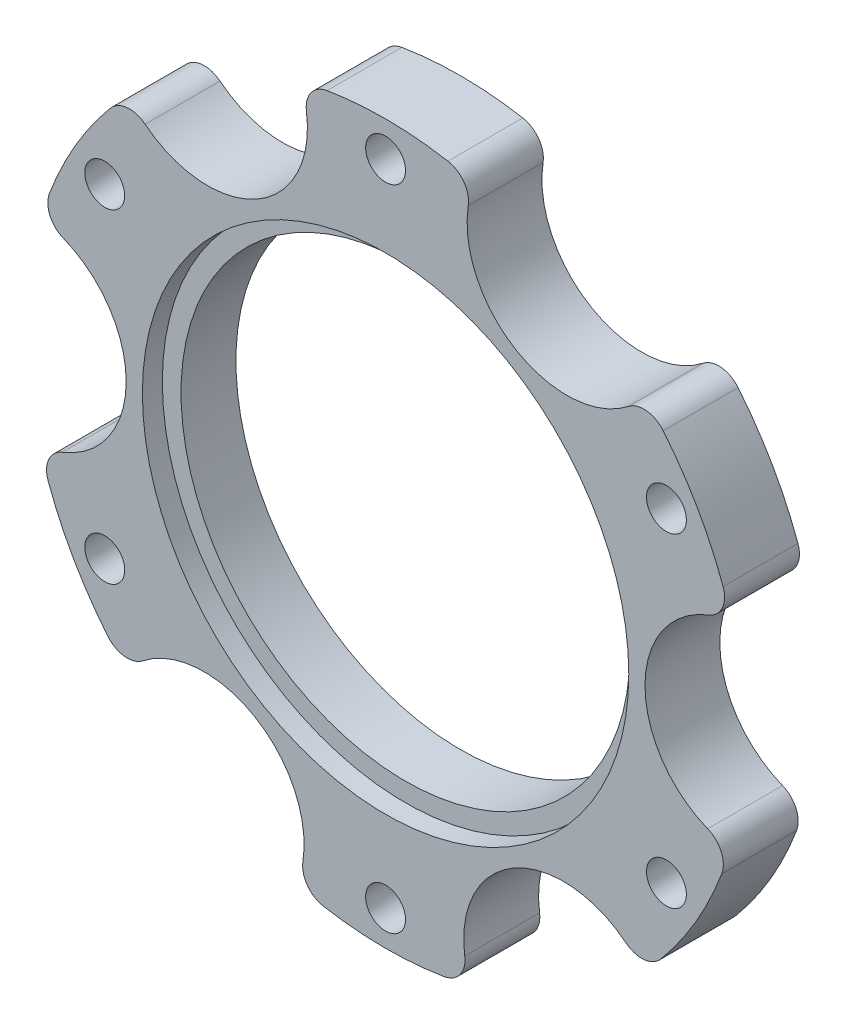
ISO-10303-21;
HEADER;
FILE_DESCRIPTION(('STEP AP214'),'2;1');
FILE_NAME('part.step','',(''),(''),'','','');
FILE_SCHEMA(('AUTOMOTIVE_DESIGN { 1 0 10303 214 1 1 1 1 }'));
ENDSEC;
DATA;
#1=APPLICATION_CONTEXT('core data for automotive mechanical design processes');
#2=APPLICATION_PROTOCOL_DEFINITION('international standard','automotive_design',2000,#1);
#3=PRODUCT_CONTEXT('',#1,'mechanical');
#4=PRODUCT('Part','Part','',(#3));
#5=PRODUCT_RELATED_PRODUCT_CATEGORY('part','',(#4));
#6=PRODUCT_DEFINITION_FORMATION('','',#4);
#7=PRODUCT_DEFINITION_CONTEXT('part definition',#1,'design');
#8=PRODUCT_DEFINITION('design','',#6,#7);
#9=PRODUCT_DEFINITION_SHAPE('','',#8);
#10=(LENGTH_UNIT() NAMED_UNIT(*) SI_UNIT(.MILLI.,.METRE.));
#11=(NAMED_UNIT(*) PLANE_ANGLE_UNIT() SI_UNIT($,.RADIAN.));
#12=(NAMED_UNIT(*) SI_UNIT($,.STERADIAN.) SOLID_ANGLE_UNIT());
#13=UNCERTAINTY_MEASURE_WITH_UNIT(LENGTH_MEASURE(1.E-05),#10,'distance_accuracy_value','');
#14=(GEOMETRIC_REPRESENTATION_CONTEXT(3) GLOBAL_UNCERTAINTY_ASSIGNED_CONTEXT((#13)) GLOBAL_UNIT_ASSIGNED_CONTEXT((#10,
#11,#12)) REPRESENTATION_CONTEXT('',''));
#15=CARTESIAN_POINT('',(0.,0.,0.));
#16=DIRECTION('',(0.,0.,1.));
#17=DIRECTION('',(1.,0.,0.));
#18=AXIS2_PLACEMENT_3D('',#15,#16,#17);
#19=CARTESIAN_POINT('',(0.,0.,3.));
#20=DIRECTION('',(0.,0.,-1.));
#21=DIRECTION('',(-1.,0.,0.));
#22=AXIS2_PLACEMENT_3D('',#19,#20,#21);
#23=CYLINDRICAL_SURFACE('',#22,14.4);
#24=CARTESIAN_POINT('',(0.,0.,0.));
#25=DIRECTION('',(0.,0.,1.));
#26=DIRECTION('',(1.,0.,0.));
#27=AXIS2_PLACEMENT_3D('',#24,#25,#26);
#28=CIRCLE('',#27,14.4);
#29=CARTESIAN_POINT('',(2.49940466150857,14.1814306872766,0.));
#30=VERTEX_POINT('',#29);
#31=CARTESIAN_POINT('',(-2.34663958909103,14.2075079672302,0.));
#32=VERTEX_POINT('',#31);
#33=EDGE_CURVE('E216',#30,#32,#28,.T.);
#34=ORIENTED_EDGE('',*,*,#33,.T.);
#35=DIRECTION('',(0.,0.,-1.));
#36=VECTOR('',#35,1.);
#37=CARTESIAN_POINT('',(-2.34663958909103,14.2075079672302,3.));
#38=LINE('',#37,#36);
#39=CARTESIAN_POINT('',(-2.34663958909103,14.2075079672302,3.));
#40=VERTEX_POINT('',#39);
#41=EDGE_CURVE('E220',#32,#40,#38,.F.);
#42=ORIENTED_EDGE('',*,*,#41,.T.);
#43=CARTESIAN_POINT('',(0.,0.,3.));
#44=DIRECTION('',(0.,0.,1.));
#45=DIRECTION('',(1.,0.,0.));
#46=AXIS2_PLACEMENT_3D('',#43,#44,#45);
#47=CIRCLE('',#46,14.4);
#48=CARTESIAN_POINT('',(2.49940466150857,14.1814306872766,3.));
#49=VERTEX_POINT('',#48);
#50=EDGE_CURVE('E219',#49,#40,#47,.T.);
#51=ORIENTED_EDGE('',*,*,#50,.F.);
#52=DIRECTION('',(0.,0.,-1.));
#53=VECTOR('',#52,1.);
#54=CARTESIAN_POINT('',(2.49940466150857,14.1814306872766,3.));
#55=LINE('',#54,#53);
#56=EDGE_CURVE('E205',#49,#30,#55,.T.);
#57=ORIENTED_EDGE('',*,*,#56,.T.);
#58=EDGE_LOOP('',(#34,#42,#51,#57));
#59=FACE_BOUND('',#58,.T.);
#60=ADVANCED_FACE('F41',(#59),#23,.T.);
#61=CARTESIAN_POINT('',(-11.0317769064353,9.25526327484207,3.));
#62=VERTEX_POINT('',#61);
#63=CARTESIAN_POINT('',(-13.4773826186367,5.07150448593597,3.));
#64=VERTEX_POINT('',#63);
#65=EDGE_CURVE('E269',#62,#64,#47,.T.);
#66=ORIENTED_EDGE('',*,*,#65,.F.);
#67=DIRECTION('',(0.,0.,-1.));
#68=VECTOR('',#67,1.);
#69=CARTESIAN_POINT('',(-11.0317769064353,9.25526327484208,3.));
#70=LINE('',#69,#68);
#71=CARTESIAN_POINT('',(-11.0317769064353,9.25526327484207,0.));
#72=VERTEX_POINT('',#71);
#73=EDGE_CURVE('E292',#62,#72,#70,.T.);
#74=ORIENTED_EDGE('',*,*,#73,.T.);
#75=CARTESIAN_POINT('',(-13.4773826186367,5.07150448593597,0.));
#76=VERTEX_POINT('',#75);
#77=EDGE_CURVE('E229',#72,#76,#28,.T.);
#78=ORIENTED_EDGE('',*,*,#77,.T.);
#79=DIRECTION('',(0.,0.,-1.));
#80=VECTOR('',#79,1.);
#81=CARTESIAN_POINT('',(-13.4773826186367,5.07150448593597,3.));
#82=LINE('',#81,#80);
#83=EDGE_CURVE('E295',#76,#64,#82,.F.);
#84=ORIENTED_EDGE('',*,*,#83,.T.);
#85=EDGE_LOOP('',(#66,#74,#78,#84));
#86=FACE_BOUND('',#85,.T.);
#87=ADVANCED_FACE('F291',(#86),#23,.T.);
#88=CARTESIAN_POINT('',(-13.531181567944,-4.92616741243449,3.));
#89=VERTEX_POINT('',#88);
#90=CARTESIAN_POINT('',(-11.1307430295456,-9.13600348129428,3.));
#91=VERTEX_POINT('',#90);
#92=EDGE_CURVE('E274',#89,#91,#47,.T.);
#93=ORIENTED_EDGE('',*,*,#92,.F.);
#94=DIRECTION('',(0.,0.,-1.));
#95=VECTOR('',#94,1.);
#96=CARTESIAN_POINT('',(-13.531181567944,-4.92616741243449,3.));
#97=LINE('',#96,#95);
#98=CARTESIAN_POINT('',(-13.531181567944,-4.92616741243449,0.));
#99=VERTEX_POINT('',#98);
#100=EDGE_CURVE('E309',#89,#99,#97,.T.);
#101=ORIENTED_EDGE('',*,*,#100,.T.);
#102=CARTESIAN_POINT('',(-11.1307430295456,-9.13600348129428,0.));
#103=VERTEX_POINT('',#102);
#104=EDGE_CURVE('E231',#99,#103,#28,.T.);
#105=ORIENTED_EDGE('',*,*,#104,.T.);
#106=DIRECTION('',(0.,0.,-1.));
#107=VECTOR('',#106,1.);
#108=CARTESIAN_POINT('',(-11.1307430295456,-9.13600348129428,3.));
#109=LINE('',#108,#107);
#110=EDGE_CURVE('E307',#103,#91,#109,.F.);
#111=ORIENTED_EDGE('',*,*,#110,.T.);
#112=EDGE_LOOP('',(#93,#101,#105,#111));
#113=FACE_BOUND('',#112,.T.);
#114=ADVANCED_FACE('F470',(#113),#23,.T.);
#115=CARTESIAN_POINT('',(-2.49940466150866,-14.1814306872765,3.));
#116=VERTEX_POINT('',#115);
#117=CARTESIAN_POINT('',(2.34663958909114,-14.2075079672302,3.));
#118=VERTEX_POINT('',#117);
#119=EDGE_CURVE('E271',#116,#118,#47,.T.);
#120=ORIENTED_EDGE('',*,*,#119,.F.);
#121=DIRECTION('',(0.,0.,-1.));
#122=VECTOR('',#121,1.);
#123=CARTESIAN_POINT('',(-2.49940466150866,-14.1814306872765,3.));
#124=LINE('',#123,#122);
#125=CARTESIAN_POINT('',(-2.49940466150866,-14.1814306872765,0.));
#126=VERTEX_POINT('',#125);
#127=EDGE_CURVE('E317',#116,#126,#124,.T.);
#128=ORIENTED_EDGE('',*,*,#127,.T.);
#129=CARTESIAN_POINT('',(2.34663958909114,-14.2075079672302,0.));
#130=VERTEX_POINT('',#129);
#131=EDGE_CURVE('E239',#126,#130,#28,.T.);
#132=ORIENTED_EDGE('',*,*,#131,.T.);
#133=DIRECTION('',(0.,0.,-1.));
#134=VECTOR('',#133,1.);
#135=CARTESIAN_POINT('',(2.34663958909114,-14.2075079672302,3.));
#136=LINE('',#135,#134);
#137=EDGE_CURVE('E315',#130,#118,#136,.F.);
#138=ORIENTED_EDGE('',*,*,#137,.T.);
#139=EDGE_LOOP('',(#120,#128,#132,#138));
#140=FACE_BOUND('',#139,.T.);
#141=ADVANCED_FACE('F485',(#140),#23,.T.);
#142=CARTESIAN_POINT('',(11.0317769064354,-9.25526327484199,3.));
#143=VERTEX_POINT('',#142);
#144=CARTESIAN_POINT('',(13.4773826186368,-5.07150448593588,3.));
#145=VERTEX_POINT('',#144);
#146=EDGE_CURVE('E233',#143,#145,#47,.T.);
#147=ORIENTED_EDGE('',*,*,#146,.F.);
#148=DIRECTION('',(0.,0.,-1.));
#149=VECTOR('',#148,1.);
#150=CARTESIAN_POINT('',(11.0317769064354,-9.25526327484199,3.));
#151=LINE('',#150,#149);
#152=CARTESIAN_POINT('',(11.0317769064354,-9.25526327484199,0.));
#153=VERTEX_POINT('',#152);
#154=EDGE_CURVE('E325',#143,#153,#151,.T.);
#155=ORIENTED_EDGE('',*,*,#154,.T.);
#156=CARTESIAN_POINT('',(13.4773826186368,-5.07150448593588,0.));
#157=VERTEX_POINT('',#156);
#158=EDGE_CURVE('E234',#153,#157,#28,.T.);
#159=ORIENTED_EDGE('',*,*,#158,.T.);
#160=DIRECTION('',(0.,0.,-1.));
#161=VECTOR('',#160,1.);
#162=CARTESIAN_POINT('',(13.4773826186368,-5.07150448593588,3.));
#163=LINE('',#162,#161);
#164=EDGE_CURVE('E323',#157,#145,#163,.F.);
#165=ORIENTED_EDGE('',*,*,#164,.T.);
#166=EDGE_LOOP('',(#147,#155,#159,#165));
#167=FACE_BOUND('',#166,.T.);
#168=ADVANCED_FACE('F475',(#167),#23,.T.);
#169=CARTESIAN_POINT('',(0.,0.,3.));
#170=DIRECTION('',(0.,0.,-1.));
#171=DIRECTION('',(-1.,0.,0.));
#172=AXIS2_PLACEMENT_3D('',#169,#170,#171);
#173=CYLINDRICAL_SURFACE('',#172,9.);
#174=CARTESIAN_POINT('',(0.,0.,0.));
#175=DIRECTION('',(0.,0.,1.));
#176=DIRECTION('',(1.,0.,0.));
#177=AXIS2_PLACEMENT_3D('',#174,#175,#176);
#178=CIRCLE('',#177,9.);
#179=CARTESIAN_POINT('',(9.,0.,0.));
#180=VERTEX_POINT('',#179);
#181=EDGE_CURVE('E251',#180,#180,#178,.T.);
#182=ORIENTED_EDGE('',*,*,#181,.F.);
#183=EDGE_LOOP('',(#182));
#184=FACE_BOUND('',#183,.T.);
#185=CARTESIAN_POINT('',(0.,0.,2.2));
#186=DIRECTION('',(0.,0.,1.));
#187=DIRECTION('',(1.,0.,0.));
#188=AXIS2_PLACEMENT_3D('',#185,#186,#187);
#189=CIRCLE('',#188,9.);
#190=CARTESIAN_POINT('',(9.,0.,2.2));
#191=VERTEX_POINT('',#190);
#192=EDGE_CURVE('E258',#191,#191,#189,.T.);
#193=ORIENTED_EDGE('',*,*,#192,.T.);
#194=EDGE_LOOP('',(#193));
#195=FACE_BOUND('',#194,.T.);
#196=ADVANCED_FACE('F484',(#184,#195),#173,.F.);
#197=CARTESIAN_POINT('',(0.,0.,3.));
#198=DIRECTION('',(0.,0.,1.));
#199=DIRECTION('',(1.,0.,0.));
#200=AXIS2_PLACEMENT_3D('',#197,#198,#199);
#201=PLANE('',#200);
#202=ORIENTED_EDGE('',*,*,#50,.T.);
#203=CARTESIAN_POINT('',(-2.18367850651527,13.2208754695059,3.));
#204=DIRECTION('',(0.,0.,1.));
#205=DIRECTION('',(1.,0.,0.));
#206=AXIS2_PLACEMENT_3D('',#203,#204,#205);
#207=CIRCLE('',#206,1.);
#208=CARTESIAN_POINT('',(-3.17350074452298,13.078566168526,3.));
#209=VERTEX_POINT('',#208);
#210=EDGE_CURVE('E367',#40,#209,#207,.T.);
#211=ORIENTED_EDGE('',*,*,#210,.T.);
#212=CARTESIAN_POINT('',(-7.13278969655384,12.5093289646062,3.));
#213=DIRECTION('',(0.,0.,1.));
#214=DIRECTION('',(1.,0.,0.));
#215=AXIS2_PLACEMENT_3D('',#212,#213,#214);
#216=CIRCLE('',#215,4.);
#217=CARTESIAN_POINT('',(-9.63910296965706,9.39189511974812,3.));
#218=VERTEX_POINT('',#217);
#219=EDGE_CURVE('E514',#218,#209,#216,.T.);
#220=ORIENTED_EDGE('',*,*,#219,.F.);
#221=CARTESIAN_POINT('',(-10.2656812879329,8.6125366585336,3.));
#222=DIRECTION('',(0.,0.,1.));
#223=DIRECTION('',(1.,0.,0.));
#224=AXIS2_PLACEMENT_3D('',#221,#222,#223);
#225=CIRCLE('',#224,1.);
#226=EDGE_CURVE('E286',#218,#62,#225,.T.);
#227=ORIENTED_EDGE('',*,*,#226,.T.);
#228=ORIENTED_EDGE('',*,*,#65,.T.);
#229=CARTESIAN_POINT('',(-12.5414532701203,4.71931667441264,3.));
#230=DIRECTION('',(0.,0.,1.));
#231=DIRECTION('',(1.,0.,0.));
#232=AXIS2_PLACEMENT_3D('',#229,#230,#231);
#233=CIRCLE('',#232,1.);
#234=CARTESIAN_POINT('',(-12.9131209192807,3.79095082057722,3.));
#235=VERTEX_POINT('',#234);
#236=EDGE_CURVE('E283',#64,#235,#233,.T.);
#237=ORIENTED_EDGE('',*,*,#236,.T.);
#238=CARTESIAN_POINT('',(-14.3997915159224,0.0774874052355363,3.));
#239=DIRECTION('',(0.,0.,1.));
#240=DIRECTION('',(1.,0.,0.));
#241=AXIS2_PLACEMENT_3D('',#238,#239,#240);
#242=CIRCLE('',#241,4.);
#243=CARTESIAN_POINT('',(-12.9531712482095,-3.65176048154302,3.));
#244=VERTEX_POINT('',#243);
#245=EDGE_CURVE('E516',#244,#235,#242,.T.);
#246=ORIENTED_EDGE('',*,*,#245,.F.);
#247=CARTESIAN_POINT('',(-12.5915161812813,-4.58407245323765,3.));
#248=DIRECTION('',(0.,0.,1.));
#249=DIRECTION('',(1.,0.,0.));
#250=AXIS2_PLACEMENT_3D('',#247,#248,#249);
#251=CIRCLE('',#250,1.);
#252=EDGE_CURVE('E363',#244,#89,#251,.T.);
#253=ORIENTED_EDGE('',*,*,#252,.T.);
#254=ORIENTED_EDGE('',*,*,#92,.T.);
#255=CARTESIAN_POINT('',(-10.357774763605,-8.50155879509329,3.));
#256=DIRECTION('',(0.,0.,1.));
#257=DIRECTION('',(1.,0.,0.));
#258=AXIS2_PLACEMENT_3D('',#255,#256,#257);
#259=CIRCLE('',#258,1.);
#260=CARTESIAN_POINT('',(-9.73962017475767,-9.28761534794876,3.));
#261=VERTEX_POINT('',#260);
#262=EDGE_CURVE('E361',#91,#261,#259,.T.);
#263=ORIENTED_EDGE('',*,*,#262,.T.);
#264=CARTESIAN_POINT('',(-7.26700181936847,-12.4318415593707,3.));
#265=DIRECTION('',(0.,0.,1.));
#266=DIRECTION('',(1.,0.,0.));
#267=AXIS2_PLACEMENT_3D('',#264,#265,#266);
#268=CIRCLE('',#267,4.);
#269=CARTESIAN_POINT('',(-3.31406827855237,-13.0436556012911,3.));
#270=VERTEX_POINT('',#269);
#271=EDGE_CURVE('E518',#270,#261,#268,.T.);
#272=ORIENTED_EDGE('',*,*,#271,.F.);
#273=CARTESIAN_POINT('',(-2.32583489334834,-13.1966091117712,3.));
#274=DIRECTION('',(0.,0.,1.));
#275=DIRECTION('',(1.,0.,0.));
#276=AXIS2_PLACEMENT_3D('',#273,#274,#275);
#277=CIRCLE('',#276,1.);
#278=EDGE_CURVE('E359',#270,#116,#277,.T.);
#279=ORIENTED_EDGE('',*,*,#278,.T.);
#280=ORIENTED_EDGE('',*,*,#119,.T.);
#281=CARTESIAN_POINT('',(2.18367850651536,-13.2208754695059,3.));
#282=DIRECTION('',(0.,0.,1.));
#283=DIRECTION('',(1.,0.,0.));
#284=AXIS2_PLACEMENT_3D('',#281,#282,#283);
#285=CIRCLE('',#284,1.);
#286=CARTESIAN_POINT('',(3.17350074452308,-13.0785661685259,3.));
#287=VERTEX_POINT('',#286);
#288=EDGE_CURVE('E357',#118,#287,#285,.T.);
#289=ORIENTED_EDGE('',*,*,#288,.T.);
#290=CARTESIAN_POINT('',(7.13278969655393,-12.5093289646061,3.));
#291=DIRECTION('',(0.,0.,1.));
#292=DIRECTION('',(1.,0.,0.));
#293=AXIS2_PLACEMENT_3D('',#290,#291,#292);
#294=CIRCLE('',#293,4.);
#295=CARTESIAN_POINT('',(9.63910296965713,-9.39189511974805,3.));
#296=VERTEX_POINT('',#295);
#297=EDGE_CURVE('E521',#296,#287,#294,.T.);
#298=ORIENTED_EDGE('',*,*,#297,.F.);
#299=CARTESIAN_POINT('',(10.2656812879329,-8.61253665853352,3.));
#300=DIRECTION('',(0.,0.,1.));
#301=DIRECTION('',(1.,0.,0.));
#302=AXIS2_PLACEMENT_3D('',#299,#300,#301);
#303=CIRCLE('',#302,1.);
#304=EDGE_CURVE('E355',#296,#143,#303,.T.);
#305=ORIENTED_EDGE('',*,*,#304,.T.);
#306=ORIENTED_EDGE('',*,*,#146,.T.);
#307=CARTESIAN_POINT('',(12.5414532701203,-4.71931667441256,3.));
#308=DIRECTION('',(0.,0.,1.));
#309=DIRECTION('',(1.,0.,0.));
#310=AXIS2_PLACEMENT_3D('',#307,#308,#309);
#311=CIRCLE('',#310,1.);
#312=CARTESIAN_POINT('',(12.9131209192807,-3.79095082057714,3.));
#313=VERTEX_POINT('',#312);
#314=EDGE_CURVE('E353',#145,#313,#311,.T.);
#315=ORIENTED_EDGE('',*,*,#314,.T.);
#316=CARTESIAN_POINT('',(14.3997915159224,-0.0774874052354444,3.));
#317=DIRECTION('',(0.,0.,1.));
#318=DIRECTION('',(1.,0.,0.));
#319=AXIS2_PLACEMENT_3D('',#316,#317,#318);
#320=CIRCLE('',#319,4.);
#321=CARTESIAN_POINT('',(12.9531712482095,3.6517604815431,3.));
#322=VERTEX_POINT('',#321);
#323=EDGE_CURVE('E345',#322,#313,#320,.T.);
#324=ORIENTED_EDGE('',*,*,#323,.F.);
#325=CARTESIAN_POINT('',(12.5915161812812,4.58407245323773,3.));
#326=DIRECTION('',(0.,0.,1.));
#327=DIRECTION('',(1.,0.,0.));
#328=AXIS2_PLACEMENT_3D('',#325,#326,#327);
#329=CIRCLE('',#328,1.);
#330=CARTESIAN_POINT('',(13.531181567944,4.92616741243457,3.));
#331=VERTEX_POINT('',#330);
#332=EDGE_CURVE('E348',#322,#331,#329,.T.);
#333=ORIENTED_EDGE('',*,*,#332,.T.);
#334=CARTESIAN_POINT('',(11.1307430295456,9.13600348129436,3.));
#335=VERTEX_POINT('',#334);
#336=EDGE_CURVE('E221',#331,#335,#47,.T.);
#337=ORIENTED_EDGE('',*,*,#336,.T.);
#338=CARTESIAN_POINT('',(10.3577747636049,8.50155879509336,3.));
#339=DIRECTION('',(0.,0.,1.));
#340=DIRECTION('',(1.,0.,0.));
#341=AXIS2_PLACEMENT_3D('',#338,#339,#340);
#342=CIRCLE('',#341,1.);
#343=CARTESIAN_POINT('',(9.7396201747576,9.28761534794883,3.));
#344=VERTEX_POINT('',#343);
#345=EDGE_CURVE('E344',#335,#344,#342,.T.);
#346=ORIENTED_EDGE('',*,*,#345,.T.);
#347=CARTESIAN_POINT('',(7.26700181936839,12.4318415593707,3.));
#348=DIRECTION('',(0.,0.,1.));
#349=DIRECTION('',(1.,0.,0.));
#350=AXIS2_PLACEMENT_3D('',#347,#348,#349);
#351=CIRCLE('',#350,4.);
#352=CARTESIAN_POINT('',(3.31406827855228,13.0436556012911,3.));
#353=VERTEX_POINT('',#352);
#354=EDGE_CURVE('E340',#353,#344,#351,.T.);
#355=ORIENTED_EDGE('',*,*,#354,.F.);
#356=CARTESIAN_POINT('',(2.32583489334825,13.1966091117712,3.));
#357=DIRECTION('',(0.,0.,1.));
#358=DIRECTION('',(1.,0.,0.));
#359=AXIS2_PLACEMENT_3D('',#356,#357,#358);
#360=CIRCLE('',#359,1.);
#361=EDGE_CURVE('E343',#353,#49,#360,.T.);
#362=ORIENTED_EDGE('',*,*,#361,.T.);
#363=EDGE_LOOP('',(#202,#211,#220,#227,#228,#237,#246,#253,#254,#263,#272,#279,#280,#289,#298,
#305,#306,#315,#324,#333,#337,#346,#355,#362));
#364=FACE_BOUND('',#363,.T.);
#365=CARTESIAN_POINT('',(0.,13.,3.));
#366=DIRECTION('',(0.,0.,1.));
#367=DIRECTION('',(1.,0.,0.));
#368=AXIS2_PLACEMENT_3D('',#365,#366,#367);
#369=CIRCLE('',#368,0.8);
#370=CARTESIAN_POINT('',(0.8,13.,3.));
#371=VERTEX_POINT('',#370);
#372=EDGE_CURVE('E404',#371,#371,#369,.T.);
#373=ORIENTED_EDGE('',*,*,#372,.F.);
#374=EDGE_LOOP('',(#373));
#375=FACE_BOUND('',#374,.T.);
#376=CARTESIAN_POINT('',(-11.2583302491976,6.50000000000013,3.));
#377=DIRECTION('',(0.,0.,1.));
#378=DIRECTION('',(1.,0.,0.));
#379=AXIS2_PLACEMENT_3D('',#376,#377,#378);
#380=CIRCLE('',#379,0.800000000000001);
#381=CARTESIAN_POINT('',(-10.4583302491976,6.50000000000013,3.));
#382=VERTEX_POINT('',#381);
#383=EDGE_CURVE('E394',#382,#382,#380,.T.);
#384=ORIENTED_EDGE('',*,*,#383,.F.);
#385=EDGE_LOOP('',(#384));
#386=FACE_BOUND('',#385,.T.);
#387=CARTESIAN_POINT('',(-11.2583302491978,-6.4999999999999,3.));
#388=DIRECTION('',(0.,0.,1.));
#389=DIRECTION('',(1.,0.,0.));
#390=AXIS2_PLACEMENT_3D('',#387,#388,#389);
#391=CIRCLE('',#390,0.800000000000001);
#392=CARTESIAN_POINT('',(-10.4583302491978,-6.4999999999999,3.));
#393=VERTEX_POINT('',#392);
#394=EDGE_CURVE('E398',#393,#393,#391,.T.);
#395=ORIENTED_EDGE('',*,*,#394,.F.);
#396=EDGE_LOOP('',(#395));
#397=FACE_BOUND('',#396,.T.);
#398=CARTESIAN_POINT('',(0.,-13.,3.));
#399=DIRECTION('',(0.,0.,1.));
#400=DIRECTION('',(1.,0.,0.));
#401=AXIS2_PLACEMENT_3D('',#398,#399,#400);
#402=CIRCLE('',#401,0.8);
#403=CARTESIAN_POINT('',(0.799999999999909,-13.,3.));
#404=VERTEX_POINT('',#403);
#405=EDGE_CURVE('E414',#404,#404,#402,.T.);
#406=ORIENTED_EDGE('',*,*,#405,.F.);
#407=EDGE_LOOP('',(#406));
#408=FACE_BOUND('',#407,.T.);
#409=CARTESIAN_POINT('',(11.2583302491977,-6.50000000000006,3.));
#410=DIRECTION('',(0.,0.,1.));
#411=DIRECTION('',(1.,0.,0.));
#412=AXIS2_PLACEMENT_3D('',#409,#410,#411);
#413=CIRCLE('',#412,0.800000000000001);
#414=CARTESIAN_POINT('',(12.0583302491977,-6.50000000000006,3.));
#415=VERTEX_POINT('',#414);
#416=EDGE_CURVE('E411',#415,#415,#413,.T.);
#417=ORIENTED_EDGE('',*,*,#416,.F.);
#418=EDGE_LOOP('',(#417));
#419=FACE_BOUND('',#418,.T.);
#420=CARTESIAN_POINT('',(11.2583302491977,6.49999999999997,3.));
#421=DIRECTION('',(0.,0.,1.));
#422=DIRECTION('',(1.,0.,0.));
#423=AXIS2_PLACEMENT_3D('',#420,#421,#422);
#424=CIRCLE('',#423,0.800000000000001);
#425=CARTESIAN_POINT('',(12.0583302491977,6.49999999999997,3.));
#426=VERTEX_POINT('',#425);
#427=EDGE_CURVE('E407',#426,#426,#424,.T.);
#428=ORIENTED_EDGE('',*,*,#427,.F.);
#429=EDGE_LOOP('',(#428));
#430=FACE_BOUND('',#429,.T.);
#431=CARTESIAN_POINT('',(0.,0.,3.));
#432=DIRECTION('',(0.,0.,1.));
#433=DIRECTION('',(1.,0.,0.));
#434=AXIS2_PLACEMENT_3D('',#431,#432,#433);
#435=CIRCLE('',#434,9.75);
#436=CARTESIAN_POINT('',(9.75,0.,3.));
#437=VERTEX_POINT('',#436);
#438=EDGE_CURVE('E264',#437,#437,#435,.T.);
#439=ORIENTED_EDGE('',*,*,#438,.F.);
#440=EDGE_LOOP('',(#439));
#441=FACE_BOUND('',#440,.T.);
#442=ADVANCED_FACE('F280',(#364,#375,#386,#397,#408,#419,#430,#441),#201,.T.);
#443=CARTESIAN_POINT('',(0.,0.,0.));
#444=DIRECTION('',(0.,0.,1.));
#445=DIRECTION('',(1.,0.,0.));
#446=AXIS2_PLACEMENT_3D('',#443,#444,#445);
#447=PLANE('',#446);
#448=CARTESIAN_POINT('',(0.,13.,0.));
#449=DIRECTION('',(0.,0.,1.));
#450=DIRECTION('',(1.,0.,0.));
#451=AXIS2_PLACEMENT_3D('',#448,#449,#450);
#452=CIRCLE('',#451,0.8);
#453=CARTESIAN_POINT('',(0.8,13.,0.));
#454=VERTEX_POINT('',#453);
#455=EDGE_CURVE('E422',#454,#454,#452,.T.);
#456=ORIENTED_EDGE('',*,*,#455,.T.);
#457=EDGE_LOOP('',(#456));
#458=FACE_BOUND('',#457,.T.);
#459=CARTESIAN_POINT('',(-11.2583302491976,6.50000000000013,0.));
#460=DIRECTION('',(0.,0.,1.));
#461=DIRECTION('',(1.,0.,0.));
#462=AXIS2_PLACEMENT_3D('',#459,#460,#461);
#463=CIRCLE('',#462,0.800000000000001);
#464=CARTESIAN_POINT('',(-10.4583302491976,6.50000000000013,0.));
#465=VERTEX_POINT('',#464);
#466=EDGE_CURVE('E426',#465,#465,#463,.T.);
#467=ORIENTED_EDGE('',*,*,#466,.T.);
#468=EDGE_LOOP('',(#467));
#469=FACE_BOUND('',#468,.T.);
#470=CARTESIAN_POINT('',(-11.2583302491978,-6.4999999999999,0.));
#471=DIRECTION('',(0.,0.,1.));
#472=DIRECTION('',(1.,0.,0.));
#473=AXIS2_PLACEMENT_3D('',#470,#471,#472);
#474=CIRCLE('',#473,0.800000000000001);
#475=CARTESIAN_POINT('',(-10.4583302491978,-6.4999999999999,0.));
#476=VERTEX_POINT('',#475);
#477=EDGE_CURVE('E431',#476,#476,#474,.T.);
#478=ORIENTED_EDGE('',*,*,#477,.T.);
#479=EDGE_LOOP('',(#478));
#480=FACE_BOUND('',#479,.T.);
#481=CARTESIAN_POINT('',(0.,-13.,0.));
#482=DIRECTION('',(0.,0.,1.));
#483=DIRECTION('',(1.,0.,0.));
#484=AXIS2_PLACEMENT_3D('',#481,#482,#483);
#485=CIRCLE('',#484,0.8);
#486=CARTESIAN_POINT('',(0.799999999999909,-13.,0.));
#487=VERTEX_POINT('',#486);
#488=EDGE_CURVE('E436',#487,#487,#485,.T.);
#489=ORIENTED_EDGE('',*,*,#488,.T.);
#490=EDGE_LOOP('',(#489));
#491=FACE_BOUND('',#490,.T.);
#492=CARTESIAN_POINT('',(11.2583302491977,-6.50000000000006,0.));
#493=DIRECTION('',(0.,0.,1.));
#494=DIRECTION('',(1.,0.,0.));
#495=AXIS2_PLACEMENT_3D('',#492,#493,#494);
#496=CIRCLE('',#495,0.800000000000001);
#497=CARTESIAN_POINT('',(12.0583302491977,-6.50000000000006,0.));
#498=VERTEX_POINT('',#497);
#499=EDGE_CURVE('E439',#498,#498,#496,.T.);
#500=ORIENTED_EDGE('',*,*,#499,.T.);
#501=EDGE_LOOP('',(#500));
#502=FACE_BOUND('',#501,.T.);
#503=CARTESIAN_POINT('',(11.2583302491977,6.49999999999997,0.));
#504=DIRECTION('',(0.,0.,1.));
#505=DIRECTION('',(1.,0.,0.));
#506=AXIS2_PLACEMENT_3D('',#503,#504,#505);
#507=CIRCLE('',#506,0.800000000000001);
#508=CARTESIAN_POINT('',(12.0583302491977,6.49999999999997,0.));
#509=VERTEX_POINT('',#508);
#510=EDGE_CURVE('E406',#509,#509,#507,.T.);
#511=ORIENTED_EDGE('',*,*,#510,.T.);
#512=EDGE_LOOP('',(#511));
#513=FACE_BOUND('',#512,.T.);
#514=CARTESIAN_POINT('',(-7.13278969655384,12.5093289646062,0.));
#515=DIRECTION('',(0.,0.,1.));
#516=DIRECTION('',(1.,0.,0.));
#517=AXIS2_PLACEMENT_3D('',#514,#515,#516);
#518=CIRCLE('',#517,4.);
#519=CARTESIAN_POINT('',(-9.63910296965706,9.39189511974812,0.));
#520=VERTEX_POINT('',#519);
#521=CARTESIAN_POINT('',(-3.17350074452298,13.078566168526,0.));
#522=VERTEX_POINT('',#521);
#523=EDGE_CURVE('E389',#520,#522,#518,.T.);
#524=ORIENTED_EDGE('',*,*,#523,.T.);
#525=CARTESIAN_POINT('',(-2.18367850651527,13.2208754695059,0.));
#526=DIRECTION('',(0.,0.,1.));
#527=DIRECTION('',(1.,0.,0.));
#528=AXIS2_PLACEMENT_3D('',#525,#526,#527);
#529=CIRCLE('',#528,1.);
#530=EDGE_CURVE('E227',#522,#32,#529,.F.);
#531=ORIENTED_EDGE('',*,*,#530,.T.);
#532=ORIENTED_EDGE('',*,*,#33,.F.);
#533=CARTESIAN_POINT('',(2.32583489334825,13.1966091117712,0.));
#534=DIRECTION('',(0.,0.,1.));
#535=DIRECTION('',(1.,0.,0.));
#536=AXIS2_PLACEMENT_3D('',#533,#534,#535);
#537=CIRCLE('',#536,1.);
#538=CARTESIAN_POINT('',(3.31406827855228,13.0436556012911,0.));
#539=VERTEX_POINT('',#538);
#540=EDGE_CURVE('E202',#30,#539,#537,.F.);
#541=ORIENTED_EDGE('',*,*,#540,.T.);
#542=CARTESIAN_POINT('',(7.26700181936839,12.4318415593707,0.));
#543=DIRECTION('',(0.,0.,1.));
#544=DIRECTION('',(1.,0.,0.));
#545=AXIS2_PLACEMENT_3D('',#542,#543,#544);
#546=CIRCLE('',#545,4.);
#547=CARTESIAN_POINT('',(9.7396201747576,9.28761534794883,0.));
#548=VERTEX_POINT('',#547);
#549=EDGE_CURVE('E342',#539,#548,#546,.T.);
#550=ORIENTED_EDGE('',*,*,#549,.T.);
#551=CARTESIAN_POINT('',(10.3577747636049,8.50155879509336,0.));
#552=DIRECTION('',(0.,0.,1.));
#553=DIRECTION('',(1.,0.,0.));
#554=AXIS2_PLACEMENT_3D('',#551,#552,#553);
#555=CIRCLE('',#554,1.);
#556=CARTESIAN_POINT('',(11.1307430295456,9.13600348129436,0.));
#557=VERTEX_POINT('',#556);
#558=EDGE_CURVE('E209',#548,#557,#555,.F.);
#559=ORIENTED_EDGE('',*,*,#558,.T.);
#560=CARTESIAN_POINT('',(13.531181567944,4.92616741243457,0.));
#561=VERTEX_POINT('',#560);
#562=EDGE_CURVE('E228',#561,#557,#28,.T.);
#563=ORIENTED_EDGE('',*,*,#562,.F.);
#564=CARTESIAN_POINT('',(12.5915161812812,4.58407245323773,0.));
#565=DIRECTION('',(0.,0.,1.));
#566=DIRECTION('',(1.,0.,0.));
#567=AXIS2_PLACEMENT_3D('',#564,#565,#566);
#568=CIRCLE('',#567,1.);
#569=CARTESIAN_POINT('',(12.9531712482095,3.6517604815431,0.));
#570=VERTEX_POINT('',#569);
#571=EDGE_CURVE('E373',#561,#570,#568,.F.);
#572=ORIENTED_EDGE('',*,*,#571,.T.);
#573=CARTESIAN_POINT('',(14.3997915159224,-0.0774874052354444,0.));
#574=DIRECTION('',(0.,0.,1.));
#575=DIRECTION('',(1.,0.,0.));
#576=AXIS2_PLACEMENT_3D('',#573,#574,#575);
#577=CIRCLE('',#576,4.);
#578=CARTESIAN_POINT('',(12.9131209192807,-3.79095082057714,0.));
#579=VERTEX_POINT('',#578);
#580=EDGE_CURVE('E507',#570,#579,#577,.T.);
#581=ORIENTED_EDGE('',*,*,#580,.T.);
#582=CARTESIAN_POINT('',(12.5414532701203,-4.71931667441256,0.));
#583=DIRECTION('',(0.,0.,1.));
#584=DIRECTION('',(1.,0.,0.));
#585=AXIS2_PLACEMENT_3D('',#582,#583,#584);
#586=CIRCLE('',#585,1.);
#587=EDGE_CURVE('E375',#579,#157,#586,.F.);
#588=ORIENTED_EDGE('',*,*,#587,.T.);
#589=ORIENTED_EDGE('',*,*,#158,.F.);
#590=CARTESIAN_POINT('',(10.2656812879329,-8.61253665853352,0.));
#591=DIRECTION('',(0.,0.,1.));
#592=DIRECTION('',(1.,0.,0.));
#593=AXIS2_PLACEMENT_3D('',#590,#591,#592);
#594=CIRCLE('',#593,1.);
#595=CARTESIAN_POINT('',(9.63910296965713,-9.39189511974805,0.));
#596=VERTEX_POINT('',#595);
#597=EDGE_CURVE('E377',#153,#596,#594,.F.);
#598=ORIENTED_EDGE('',*,*,#597,.T.);
#599=CARTESIAN_POINT('',(7.13278969655393,-12.5093289646061,0.));
#600=DIRECTION('',(0.,0.,1.));
#601=DIRECTION('',(1.,0.,0.));
#602=AXIS2_PLACEMENT_3D('',#599,#600,#601);
#603=CIRCLE('',#602,4.);
#604=CARTESIAN_POINT('',(3.17350074452308,-13.0785661685259,0.));
#605=VERTEX_POINT('',#604);
#606=EDGE_CURVE('E500',#596,#605,#603,.T.);
#607=ORIENTED_EDGE('',*,*,#606,.T.);
#608=CARTESIAN_POINT('',(2.18367850651536,-13.2208754695059,0.));
#609=DIRECTION('',(0.,0.,1.));
#610=DIRECTION('',(1.,0.,0.));
#611=AXIS2_PLACEMENT_3D('',#608,#609,#610);
#612=CIRCLE('',#611,1.);
#613=EDGE_CURVE('E379',#605,#130,#612,.F.);
#614=ORIENTED_EDGE('',*,*,#613,.T.);
#615=ORIENTED_EDGE('',*,*,#131,.F.);
#616=CARTESIAN_POINT('',(-2.32583489334834,-13.1966091117712,0.));
#617=DIRECTION('',(0.,0.,1.));
#618=DIRECTION('',(1.,0.,0.));
#619=AXIS2_PLACEMENT_3D('',#616,#617,#618);
#620=CIRCLE('',#619,1.);
#621=CARTESIAN_POINT('',(-3.31406827855237,-13.0436556012911,0.));
#622=VERTEX_POINT('',#621);
#623=EDGE_CURVE('E381',#126,#622,#620,.F.);
#624=ORIENTED_EDGE('',*,*,#623,.T.);
#625=CARTESIAN_POINT('',(-7.26700181936847,-12.4318415593707,0.));
#626=DIRECTION('',(0.,0.,1.));
#627=DIRECTION('',(1.,0.,0.));
#628=AXIS2_PLACEMENT_3D('',#625,#626,#627);
#629=CIRCLE('',#628,4.);
#630=CARTESIAN_POINT('',(-9.73962017475767,-9.28761534794876,0.));
#631=VERTEX_POINT('',#630);
#632=EDGE_CURVE('E400',#622,#631,#629,.T.);
#633=ORIENTED_EDGE('',*,*,#632,.T.);
#634=CARTESIAN_POINT('',(-10.357774763605,-8.50155879509329,0.));
#635=DIRECTION('',(0.,0.,1.));
#636=DIRECTION('',(1.,0.,0.));
#637=AXIS2_PLACEMENT_3D('',#634,#635,#636);
#638=CIRCLE('',#637,1.);
#639=EDGE_CURVE('E383',#631,#103,#638,.F.);
#640=ORIENTED_EDGE('',*,*,#639,.T.);
#641=ORIENTED_EDGE('',*,*,#104,.F.);
#642=CARTESIAN_POINT('',(-12.5915161812813,-4.58407245323765,0.));
#643=DIRECTION('',(0.,0.,1.));
#644=DIRECTION('',(1.,0.,0.));
#645=AXIS2_PLACEMENT_3D('',#642,#643,#644);
#646=CIRCLE('',#645,1.);
#647=CARTESIAN_POINT('',(-12.9531712482095,-3.65176048154302,0.));
#648=VERTEX_POINT('',#647);
#649=EDGE_CURVE('E63',#99,#648,#646,.F.);
#650=ORIENTED_EDGE('',*,*,#649,.T.);
#651=CARTESIAN_POINT('',(-14.3997915159224,0.0774874052355363,0.));
#652=DIRECTION('',(0.,0.,1.));
#653=DIRECTION('',(1.,0.,0.));
#654=AXIS2_PLACEMENT_3D('',#651,#652,#653);
#655=CIRCLE('',#654,4.);
#656=CARTESIAN_POINT('',(-12.9131209192807,3.79095082057722,0.));
#657=VERTEX_POINT('',#656);
#658=EDGE_CURVE('E395',#648,#657,#655,.T.);
#659=ORIENTED_EDGE('',*,*,#658,.T.);
#660=CARTESIAN_POINT('',(-12.5414532701203,4.71931667441264,0.));
#661=DIRECTION('',(0.,0.,1.));
#662=DIRECTION('',(1.,0.,0.));
#663=AXIS2_PLACEMENT_3D('',#660,#661,#662);
#664=CIRCLE('',#663,1.);
#665=EDGE_CURVE('E386',#657,#76,#664,.F.);
#666=ORIENTED_EDGE('',*,*,#665,.T.);
#667=ORIENTED_EDGE('',*,*,#77,.F.);
#668=CARTESIAN_POINT('',(-10.2656812879329,8.6125366585336,0.));
#669=DIRECTION('',(0.,0.,1.));
#670=DIRECTION('',(1.,0.,0.));
#671=AXIS2_PLACEMENT_3D('',#668,#669,#670);
#672=CIRCLE('',#671,1.);
#673=EDGE_CURVE('E299',#72,#520,#672,.F.);
#674=ORIENTED_EDGE('',*,*,#673,.T.);
#675=EDGE_LOOP('',(#524,#531,#532,#541,#550,#559,#563,#572,#581,#588,#589,#598,#607,#614,#615,
#624,#633,#640,#641,#650,#659,#666,#667,#674));
#676=FACE_BOUND('',#675,.T.);
#677=ORIENTED_EDGE('',*,*,#181,.T.);
#678=EDGE_LOOP('',(#677));
#679=FACE_BOUND('',#678,.T.);
#680=ADVANCED_FACE('F224',(#458,#469,#480,#491,#502,#513,#676,#679),#447,.F.);
#681=ORIENTED_EDGE('',*,*,#336,.F.);
#682=DIRECTION('',(0.,0.,-1.));
#683=VECTOR('',#682,1.);
#684=CARTESIAN_POINT('',(13.531181567944,4.92616741243457,3.));
#685=LINE('',#684,#683);
#686=EDGE_CURVE('E334',#331,#561,#685,.T.);
#687=ORIENTED_EDGE('',*,*,#686,.T.);
#688=ORIENTED_EDGE('',*,*,#562,.T.);
#689=DIRECTION('',(0.,0.,-1.));
#690=VECTOR('',#689,1.);
#691=CARTESIAN_POINT('',(11.1307430295456,9.13600348129436,3.));
#692=LINE('',#691,#690);
#693=EDGE_CURVE('E331',#557,#335,#692,.F.);
#694=ORIENTED_EDGE('',*,*,#693,.T.);
#695=EDGE_LOOP('',(#681,#687,#688,#694));
#696=FACE_BOUND('',#695,.T.);
#697=ADVANCED_FACE('F465',(#696),#23,.T.);
#698=CARTESIAN_POINT('',(0.,0.,2.2));
#699=DIRECTION('',(0.,0.,1.));
#700=DIRECTION('',(1.,0.,0.));
#701=AXIS2_PLACEMENT_3D('',#698,#699,#700);
#702=CYLINDRICAL_SURFACE('',#701,9.75);
#703=CARTESIAN_POINT('',(0.,0.,2.2));
#704=DIRECTION('',(0.,0.,1.));
#705=DIRECTION('',(1.,0.,0.));
#706=AXIS2_PLACEMENT_3D('',#703,#704,#705);
#707=CIRCLE('',#706,9.75);
#708=CARTESIAN_POINT('',(9.75,0.,2.2));
#709=VERTEX_POINT('',#708);
#710=EDGE_CURVE('E262',#709,#709,#707,.T.);
#711=ORIENTED_EDGE('',*,*,#710,.F.);
#712=EDGE_LOOP('',(#711));
#713=FACE_BOUND('',#712,.T.);
#714=ORIENTED_EDGE('',*,*,#438,.T.);
#715=EDGE_LOOP('',(#714));
#716=FACE_BOUND('',#715,.T.);
#717=ADVANCED_FACE('F459',(#713,#716),#702,.F.);
#718=CARTESIAN_POINT('',(0.,0.,2.2));
#719=DIRECTION('',(0.,0.,1.));
#720=DIRECTION('',(1.,0.,0.));
#721=AXIS2_PLACEMENT_3D('',#718,#719,#720);
#722=PLANE('',#721);
#723=ORIENTED_EDGE('',*,*,#192,.F.);
#724=EDGE_LOOP('',(#723));
#725=FACE_BOUND('',#724,.T.);
#726=ORIENTED_EDGE('',*,*,#710,.T.);
#727=EDGE_LOOP('',(#726));
#728=FACE_BOUND('',#727,.T.);
#729=ADVANCED_FACE('F449',(#725,#728),#722,.T.);
#730=CARTESIAN_POINT('',(11.2583302491977,6.49999999999997,-7.));
#731=DIRECTION('',(0.,0.,1.));
#732=DIRECTION('',(1.,0.,0.));
#733=AXIS2_PLACEMENT_3D('',#730,#731,#732);
#734=CYLINDRICAL_SURFACE('',#733,0.800000000000001);
#735=ORIENTED_EDGE('',*,*,#427,.T.);
#736=EDGE_LOOP('',(#735));
#737=FACE_BOUND('',#736,.T.);
#738=ORIENTED_EDGE('',*,*,#510,.F.);
#739=EDGE_LOOP('',(#738));
#740=FACE_BOUND('',#739,.T.);
#741=ADVANCED_FACE('F446',(#737,#740),#734,.F.);
#742=CARTESIAN_POINT('',(11.2583302491977,-6.50000000000006,-7.));
#743=DIRECTION('',(0.,0.,1.));
#744=DIRECTION('',(1.,0.,0.));
#745=AXIS2_PLACEMENT_3D('',#742,#743,#744);
#746=CYLINDRICAL_SURFACE('',#745,0.800000000000001);
#747=ORIENTED_EDGE('',*,*,#416,.T.);
#748=EDGE_LOOP('',(#747));
#749=FACE_BOUND('',#748,.T.);
#750=ORIENTED_EDGE('',*,*,#499,.F.);
#751=EDGE_LOOP('',(#750));
#752=FACE_BOUND('',#751,.T.);
#753=ADVANCED_FACE('F448',(#749,#752),#746,.F.);
#754=CARTESIAN_POINT('',(0.,-13.,-7.));
#755=DIRECTION('',(0.,0.,1.));
#756=DIRECTION('',(1.,0.,0.));
#757=AXIS2_PLACEMENT_3D('',#754,#755,#756);
#758=CYLINDRICAL_SURFACE('',#757,0.8);
#759=ORIENTED_EDGE('',*,*,#405,.T.);
#760=EDGE_LOOP('',(#759));
#761=FACE_BOUND('',#760,.T.);
#762=ORIENTED_EDGE('',*,*,#488,.F.);
#763=EDGE_LOOP('',(#762));
#764=FACE_BOUND('',#763,.T.);
#765=ADVANCED_FACE('F456',(#761,#764),#758,.F.);
#766=CARTESIAN_POINT('',(-11.2583302491978,-6.4999999999999,-7.));
#767=DIRECTION('',(0.,0.,1.));
#768=DIRECTION('',(1.,0.,0.));
#769=AXIS2_PLACEMENT_3D('',#766,#767,#768);
#770=CYLINDRICAL_SURFACE('',#769,0.800000000000001);
#771=ORIENTED_EDGE('',*,*,#394,.T.);
#772=EDGE_LOOP('',(#771));
#773=FACE_BOUND('',#772,.T.);
#774=ORIENTED_EDGE('',*,*,#477,.F.);
#775=EDGE_LOOP('',(#774));
#776=FACE_BOUND('',#775,.T.);
#777=ADVANCED_FACE('F594',(#773,#776),#770,.F.);
#778=CARTESIAN_POINT('',(-11.2583302491976,6.50000000000013,-7.));
#779=DIRECTION('',(0.,0.,1.));
#780=DIRECTION('',(1.,0.,0.));
#781=AXIS2_PLACEMENT_3D('',#778,#779,#780);
#782=CYLINDRICAL_SURFACE('',#781,0.800000000000001);
#783=ORIENTED_EDGE('',*,*,#383,.T.);
#784=EDGE_LOOP('',(#783));
#785=FACE_BOUND('',#784,.T.);
#786=ORIENTED_EDGE('',*,*,#466,.F.);
#787=EDGE_LOOP('',(#786));
#788=FACE_BOUND('',#787,.T.);
#789=ADVANCED_FACE('F591',(#785,#788),#782,.F.);
#790=CARTESIAN_POINT('',(0.,13.,-7.));
#791=DIRECTION('',(0.,0.,1.));
#792=DIRECTION('',(1.,0.,0.));
#793=AXIS2_PLACEMENT_3D('',#790,#791,#792);
#794=CYLINDRICAL_SURFACE('',#793,0.8);
#795=ORIENTED_EDGE('',*,*,#372,.T.);
#796=EDGE_LOOP('',(#795));
#797=FACE_BOUND('',#796,.T.);
#798=ORIENTED_EDGE('',*,*,#455,.F.);
#799=EDGE_LOOP('',(#798));
#800=FACE_BOUND('',#799,.T.);
#801=ADVANCED_FACE('F590',(#797,#800),#794,.F.);
#802=CARTESIAN_POINT('',(7.26700181936839,12.4318415593707,-7.));
#803=DIRECTION('',(0.,0.,1.));
#804=DIRECTION('',(1.,0.,0.));
#805=AXIS2_PLACEMENT_3D('',#802,#803,#804);
#806=CYLINDRICAL_SURFACE('',#805,4.);
#807=ORIENTED_EDGE('',*,*,#354,.T.);
#808=DIRECTION('',(0.,0.,1.));
#809=VECTOR('',#808,1.);
#810=CARTESIAN_POINT('',(9.7396201747576,9.28761534794883,-7.));
#811=LINE('',#810,#809);
#812=EDGE_CURVE('E11',#344,#548,#811,.F.);
#813=ORIENTED_EDGE('',*,*,#812,.T.);
#814=ORIENTED_EDGE('',*,*,#549,.F.);
#815=DIRECTION('',(0.,0.,1.));
#816=VECTOR('',#815,1.);
#817=CARTESIAN_POINT('',(3.31406827855228,13.0436556012911,-7.));
#818=LINE('',#817,#816);
#819=EDGE_CURVE('E49',#539,#353,#818,.T.);
#820=ORIENTED_EDGE('',*,*,#819,.T.);
#821=EDGE_LOOP('',(#807,#813,#814,#820));
#822=FACE_BOUND('',#821,.T.);
#823=ADVANCED_FACE('F339',(#822),#806,.F.);
#824=CARTESIAN_POINT('',(14.3997915159224,-0.0774874052354444,-7.));
#825=DIRECTION('',(0.,0.,1.));
#826=DIRECTION('',(1.,0.,0.));
#827=AXIS2_PLACEMENT_3D('',#824,#825,#826);
#828=CYLINDRICAL_SURFACE('',#827,4.);
#829=ORIENTED_EDGE('',*,*,#323,.T.);
#830=DIRECTION('',(0.,0.,1.));
#831=VECTOR('',#830,1.);
#832=CARTESIAN_POINT('',(12.9131209192807,-3.79095082057714,-7.));
#833=LINE('',#832,#831);
#834=EDGE_CURVE('E329',#313,#579,#833,.F.);
#835=ORIENTED_EDGE('',*,*,#834,.T.);
#836=ORIENTED_EDGE('',*,*,#580,.F.);
#837=DIRECTION('',(0.,0.,1.));
#838=VECTOR('',#837,1.);
#839=CARTESIAN_POINT('',(12.9531712482095,3.6517604815431,-7.));
#840=LINE('',#839,#838);
#841=EDGE_CURVE('E327',#570,#322,#840,.T.);
#842=ORIENTED_EDGE('',*,*,#841,.T.);
#843=EDGE_LOOP('',(#829,#835,#836,#842));
#844=FACE_BOUND('',#843,.T.);
#845=ADVANCED_FACE('F527',(#844),#828,.F.);
#846=CARTESIAN_POINT('',(7.13278969655393,-12.5093289646061,-7.));
#847=DIRECTION('',(0.,0.,1.));
#848=DIRECTION('',(1.,0.,0.));
#849=AXIS2_PLACEMENT_3D('',#846,#847,#848);
#850=CYLINDRICAL_SURFACE('',#849,4.);
#851=ORIENTED_EDGE('',*,*,#297,.T.);
#852=DIRECTION('',(0.,0.,1.));
#853=VECTOR('',#852,1.);
#854=CARTESIAN_POINT('',(3.17350074452308,-13.0785661685259,-7.));
#855=LINE('',#854,#853);
#856=EDGE_CURVE('E321',#287,#605,#855,.F.);
#857=ORIENTED_EDGE('',*,*,#856,.T.);
#858=ORIENTED_EDGE('',*,*,#606,.F.);
#859=DIRECTION('',(0.,0.,1.));
#860=VECTOR('',#859,1.);
#861=CARTESIAN_POINT('',(9.63910296965713,-9.39189511974805,-7.));
#862=LINE('',#861,#860);
#863=EDGE_CURVE('E319',#596,#296,#862,.T.);
#864=ORIENTED_EDGE('',*,*,#863,.T.);
#865=EDGE_LOOP('',(#851,#857,#858,#864));
#866=FACE_BOUND('',#865,.T.);
#867=ADVANCED_FACE('F504',(#866),#850,.F.);
#868=CARTESIAN_POINT('',(-7.26700181936847,-12.4318415593707,-7.));
#869=DIRECTION('',(0.,0.,1.));
#870=DIRECTION('',(1.,0.,0.));
#871=AXIS2_PLACEMENT_3D('',#868,#869,#870);
#872=CYLINDRICAL_SURFACE('',#871,4.);
#873=ORIENTED_EDGE('',*,*,#271,.T.);
#874=DIRECTION('',(0.,0.,1.));
#875=VECTOR('',#874,1.);
#876=CARTESIAN_POINT('',(-9.73962017475767,-9.28761534794876,-7.));
#877=LINE('',#876,#875);
#878=EDGE_CURVE('E313',#261,#631,#877,.F.);
#879=ORIENTED_EDGE('',*,*,#878,.T.);
#880=ORIENTED_EDGE('',*,*,#632,.F.);
#881=DIRECTION('',(0.,0.,1.));
#882=VECTOR('',#881,1.);
#883=CARTESIAN_POINT('',(-3.31406827855237,-13.0436556012911,-7.));
#884=LINE('',#883,#882);
#885=EDGE_CURVE('E311',#622,#270,#884,.T.);
#886=ORIENTED_EDGE('',*,*,#885,.T.);
#887=EDGE_LOOP('',(#873,#879,#880,#886));
#888=FACE_BOUND('',#887,.T.);
#889=ADVANCED_FACE('F585',(#888),#872,.F.);
#890=CARTESIAN_POINT('',(-14.3997915159224,0.0774874052355363,-7.));
#891=DIRECTION('',(0.,0.,1.));
#892=DIRECTION('',(1.,0.,0.));
#893=AXIS2_PLACEMENT_3D('',#890,#891,#892);
#894=CYLINDRICAL_SURFACE('',#893,4.);
#895=ORIENTED_EDGE('',*,*,#245,.T.);
#896=DIRECTION('',(0.,0.,1.));
#897=VECTOR('',#896,1.);
#898=CARTESIAN_POINT('',(-12.9131209192807,3.79095082057722,-7.));
#899=LINE('',#898,#897);
#900=EDGE_CURVE('E56',#235,#657,#899,.F.);
#901=ORIENTED_EDGE('',*,*,#900,.T.);
#902=ORIENTED_EDGE('',*,*,#658,.F.);
#903=DIRECTION('',(0.,0.,1.));
#904=VECTOR('',#903,1.);
#905=CARTESIAN_POINT('',(-12.9531712482095,-3.65176048154302,-7.));
#906=LINE('',#905,#904);
#907=EDGE_CURVE('E300',#648,#244,#906,.T.);
#908=ORIENTED_EDGE('',*,*,#907,.T.);
#909=EDGE_LOOP('',(#895,#901,#902,#908));
#910=FACE_BOUND('',#909,.T.);
#911=ADVANCED_FACE('F580',(#910),#894,.F.);
#912=CARTESIAN_POINT('',(-7.13278969655384,12.5093289646062,-7.));
#913=DIRECTION('',(0.,0.,1.));
#914=DIRECTION('',(1.,0.,0.));
#915=AXIS2_PLACEMENT_3D('',#912,#913,#914);
#916=CYLINDRICAL_SURFACE('',#915,4.);
#917=ORIENTED_EDGE('',*,*,#219,.T.);
#918=DIRECTION('',(0.,0.,1.));
#919=VECTOR('',#918,1.);
#920=CARTESIAN_POINT('',(-3.17350074452298,13.078566168526,-7.));
#921=LINE('',#920,#919);
#922=EDGE_CURVE('E210',#209,#522,#921,.F.);
#923=ORIENTED_EDGE('',*,*,#922,.T.);
#924=ORIENTED_EDGE('',*,*,#523,.F.);
#925=DIRECTION('',(0.,0.,1.));
#926=VECTOR('',#925,1.);
#927=CARTESIAN_POINT('',(-9.63910296965706,9.39189511974812,-7.));
#928=LINE('',#927,#926);
#929=EDGE_CURVE('E369',#520,#218,#928,.T.);
#930=ORIENTED_EDGE('',*,*,#929,.T.);
#931=EDGE_LOOP('',(#917,#923,#924,#930));
#932=FACE_BOUND('',#931,.T.);
#933=ADVANCED_FACE('F392',(#932),#916,.F.);
#934=CARTESIAN_POINT('',(-2.18367850651527,13.2208754695059,-7.));
#935=DIRECTION('',(0.,0.,-1.));
#936=DIRECTION('',(-1.,0.,0.));
#937=AXIS2_PLACEMENT_3D('',#934,#935,#936);
#938=CYLINDRICAL_SURFACE('',#937,1.);
#939=ORIENTED_EDGE('',*,*,#530,.F.);
#940=ORIENTED_EDGE('',*,*,#922,.F.);
#941=ORIENTED_EDGE('',*,*,#210,.F.);
#942=ORIENTED_EDGE('',*,*,#41,.F.);
#943=EDGE_LOOP('',(#939,#940,#941,#942));
#944=FACE_BOUND('',#943,.T.);
#945=ADVANCED_FACE('F574',(#944),#938,.T.);
#946=CARTESIAN_POINT('',(-10.2656812879329,8.6125366585336,-7.));
#947=DIRECTION('',(0.,0.,1.));
#948=DIRECTION('',(1.,0.,0.));
#949=AXIS2_PLACEMENT_3D('',#946,#947,#948);
#950=CYLINDRICAL_SURFACE('',#949,1.);
#951=ORIENTED_EDGE('',*,*,#226,.F.);
#952=ORIENTED_EDGE('',*,*,#929,.F.);
#953=ORIENTED_EDGE('',*,*,#673,.F.);
#954=ORIENTED_EDGE('',*,*,#73,.F.);
#955=EDGE_LOOP('',(#951,#952,#953,#954));
#956=FACE_BOUND('',#955,.T.);
#957=ADVANCED_FACE('F297',(#956),#950,.T.);
#958=CARTESIAN_POINT('',(-12.5414532701203,4.71931667441264,-7.));
#959=DIRECTION('',(0.,0.,-1.));
#960=DIRECTION('',(-1.,0.,0.));
#961=AXIS2_PLACEMENT_3D('',#958,#959,#960);
#962=CYLINDRICAL_SURFACE('',#961,1.);
#963=ORIENTED_EDGE('',*,*,#665,.F.);
#964=ORIENTED_EDGE('',*,*,#900,.F.);
#965=ORIENTED_EDGE('',*,*,#236,.F.);
#966=ORIENTED_EDGE('',*,*,#83,.F.);
#967=EDGE_LOOP('',(#963,#964,#965,#966));
#968=FACE_BOUND('',#967,.T.);
#969=ADVANCED_FACE('F568',(#968),#962,.T.);
#970=CARTESIAN_POINT('',(-12.5915161812813,-4.58407245323765,-7.));
#971=DIRECTION('',(0.,0.,1.));
#972=DIRECTION('',(1.,0.,0.));
#973=AXIS2_PLACEMENT_3D('',#970,#971,#972);
#974=CYLINDRICAL_SURFACE('',#973,1.);
#975=ORIENTED_EDGE('',*,*,#252,.F.);
#976=ORIENTED_EDGE('',*,*,#907,.F.);
#977=ORIENTED_EDGE('',*,*,#649,.F.);
#978=ORIENTED_EDGE('',*,*,#100,.F.);
#979=EDGE_LOOP('',(#975,#976,#977,#978));
#980=FACE_BOUND('',#979,.T.);
#981=ADVANCED_FACE('F564',(#980),#974,.T.);
#982=CARTESIAN_POINT('',(-10.357774763605,-8.50155879509329,-7.));
#983=DIRECTION('',(0.,0.,-1.));
#984=DIRECTION('',(-1.,0.,0.));
#985=AXIS2_PLACEMENT_3D('',#982,#983,#984);
#986=CYLINDRICAL_SURFACE('',#985,1.);
#987=ORIENTED_EDGE('',*,*,#639,.F.);
#988=ORIENTED_EDGE('',*,*,#878,.F.);
#989=ORIENTED_EDGE('',*,*,#262,.F.);
#990=ORIENTED_EDGE('',*,*,#110,.F.);
#991=EDGE_LOOP('',(#987,#988,#989,#990));
#992=FACE_BOUND('',#991,.T.);
#993=ADVANCED_FACE('F560',(#992),#986,.T.);
#994=CARTESIAN_POINT('',(-2.32583489334834,-13.1966091117712,-7.));
#995=DIRECTION('',(0.,0.,1.));
#996=DIRECTION('',(1.,0.,0.));
#997=AXIS2_PLACEMENT_3D('',#994,#995,#996);
#998=CYLINDRICAL_SURFACE('',#997,1.);
#999=ORIENTED_EDGE('',*,*,#278,.F.);
#1000=ORIENTED_EDGE('',*,*,#885,.F.);
#1001=ORIENTED_EDGE('',*,*,#623,.F.);
#1002=ORIENTED_EDGE('',*,*,#127,.F.);
#1003=EDGE_LOOP('',(#999,#1000,#1001,#1002));
#1004=FACE_BOUND('',#1003,.T.);
#1005=ADVANCED_FACE('F556',(#1004),#998,.T.);
#1006=CARTESIAN_POINT('',(2.18367850651536,-13.2208754695059,-7.));
#1007=DIRECTION('',(0.,0.,-1.));
#1008=DIRECTION('',(-1.,0.,0.));
#1009=AXIS2_PLACEMENT_3D('',#1006,#1007,#1008);
#1010=CYLINDRICAL_SURFACE('',#1009,1.);
#1011=ORIENTED_EDGE('',*,*,#613,.F.);
#1012=ORIENTED_EDGE('',*,*,#856,.F.);
#1013=ORIENTED_EDGE('',*,*,#288,.F.);
#1014=ORIENTED_EDGE('',*,*,#137,.F.);
#1015=EDGE_LOOP('',(#1011,#1012,#1013,#1014));
#1016=FACE_BOUND('',#1015,.T.);
#1017=ADVANCED_FACE('F553',(#1016),#1010,.T.);
#1018=CARTESIAN_POINT('',(10.2656812879329,-8.61253665853352,-7.));
#1019=DIRECTION('',(0.,0.,1.));
#1020=DIRECTION('',(1.,0.,0.));
#1021=AXIS2_PLACEMENT_3D('',#1018,#1019,#1020);
#1022=CYLINDRICAL_SURFACE('',#1021,1.);
#1023=ORIENTED_EDGE('',*,*,#304,.F.);
#1024=ORIENTED_EDGE('',*,*,#863,.F.);
#1025=ORIENTED_EDGE('',*,*,#597,.F.);
#1026=ORIENTED_EDGE('',*,*,#154,.F.);
#1027=EDGE_LOOP('',(#1023,#1024,#1025,#1026));
#1028=FACE_BOUND('',#1027,.T.);
#1029=ADVANCED_FACE('F496',(#1028),#1022,.T.);
#1030=CARTESIAN_POINT('',(12.5414532701203,-4.71931667441256,-7.));
#1031=DIRECTION('',(0.,0.,-1.));
#1032=DIRECTION('',(-1.,0.,0.));
#1033=AXIS2_PLACEMENT_3D('',#1030,#1031,#1032);
#1034=CYLINDRICAL_SURFACE('',#1033,1.);
#1035=ORIENTED_EDGE('',*,*,#587,.F.);
#1036=ORIENTED_EDGE('',*,*,#834,.F.);
#1037=ORIENTED_EDGE('',*,*,#314,.F.);
#1038=ORIENTED_EDGE('',*,*,#164,.F.);
#1039=EDGE_LOOP('',(#1035,#1036,#1037,#1038));
#1040=FACE_BOUND('',#1039,.T.);
#1041=ADVANCED_FACE('F533',(#1040),#1034,.T.);
#1042=CARTESIAN_POINT('',(12.5915161812812,4.58407245323773,-7.));
#1043=DIRECTION('',(0.,0.,1.));
#1044=DIRECTION('',(1.,0.,0.));
#1045=AXIS2_PLACEMENT_3D('',#1042,#1043,#1044);
#1046=CYLINDRICAL_SURFACE('',#1045,1.);
#1047=ORIENTED_EDGE('',*,*,#332,.F.);
#1048=ORIENTED_EDGE('',*,*,#841,.F.);
#1049=ORIENTED_EDGE('',*,*,#571,.F.);
#1050=ORIENTED_EDGE('',*,*,#686,.F.);
#1051=EDGE_LOOP('',(#1047,#1048,#1049,#1050));
#1052=FACE_BOUND('',#1051,.T.);
#1053=ADVANCED_FACE('F536',(#1052),#1046,.T.);
#1054=CARTESIAN_POINT('',(10.3577747636049,8.50155879509336,-7.));
#1055=DIRECTION('',(0.,0.,-1.));
#1056=DIRECTION('',(-1.,0.,0.));
#1057=AXIS2_PLACEMENT_3D('',#1054,#1055,#1056);
#1058=CYLINDRICAL_SURFACE('',#1057,1.);
#1059=ORIENTED_EDGE('',*,*,#558,.F.);
#1060=ORIENTED_EDGE('',*,*,#812,.F.);
#1061=ORIENTED_EDGE('',*,*,#345,.F.);
#1062=ORIENTED_EDGE('',*,*,#693,.F.);
#1063=EDGE_LOOP('',(#1059,#1060,#1061,#1062));
#1064=FACE_BOUND('',#1063,.T.);
#1065=ADVANCED_FACE('F541',(#1064),#1058,.T.);
#1066=CARTESIAN_POINT('',(2.32583489334825,13.1966091117712,-7.));
#1067=DIRECTION('',(0.,0.,1.));
#1068=DIRECTION('',(1.,0.,0.));
#1069=AXIS2_PLACEMENT_3D('',#1066,#1067,#1068);
#1070=CYLINDRICAL_SURFACE('',#1069,1.);
#1071=ORIENTED_EDGE('',*,*,#361,.F.);
#1072=ORIENTED_EDGE('',*,*,#819,.F.);
#1073=ORIENTED_EDGE('',*,*,#540,.F.);
#1074=ORIENTED_EDGE('',*,*,#56,.F.);
#1075=EDGE_LOOP('',(#1071,#1072,#1073,#1074));
#1076=FACE_BOUND('',#1075,.T.);
#1077=ADVANCED_FACE('F43',(#1076),#1070,.T.);
#1078=CLOSED_SHELL('',(#60,#87,#114,#141,#168,#196,#442,#680,#697,#717,#729,#741,#753,#765,#777,
#789,#801,#823,#845,#867,#889,#911,#933,#945,#957,#969,#981,#993,#1005,#1017,#1029,#1041,#1053,
#1065,#1077));
#1079=MANIFOLD_SOLID_BREP('B2',#1078);
#1080=ADVANCED_BREP_SHAPE_REPRESENTATION('',(#18,#1079),#14);
#1081=SHAPE_DEFINITION_REPRESENTATION(#9,#1080);
ENDSEC;
END-ISO-10303-21;
